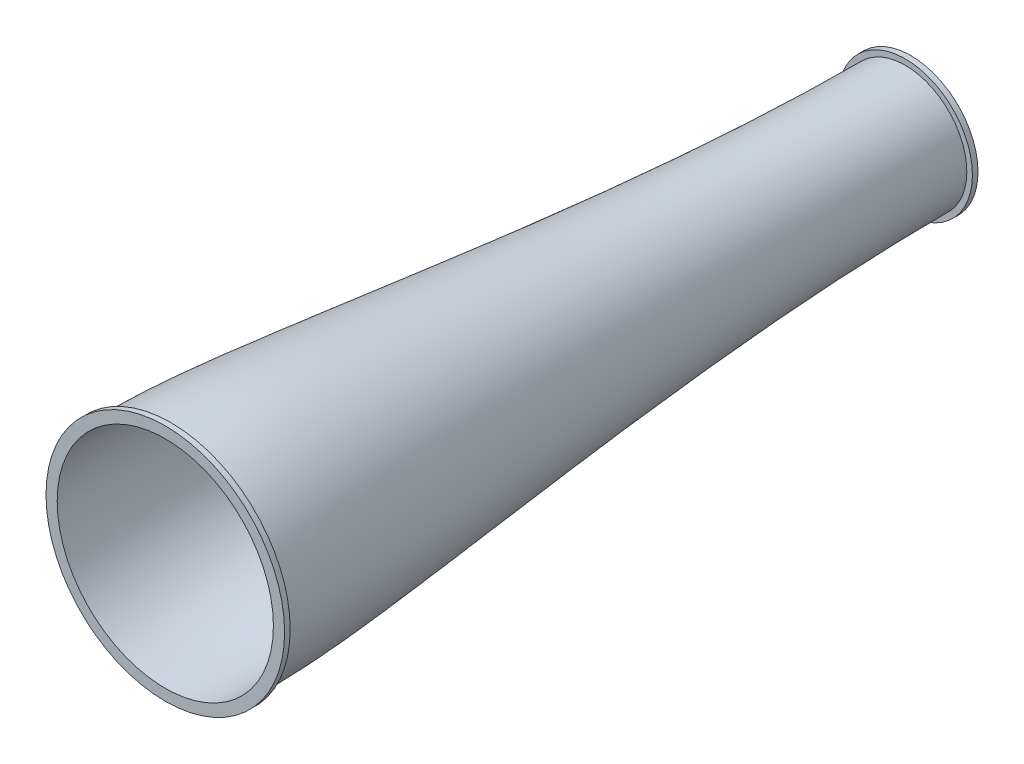
ISO-10303-21;
HEADER;
FILE_DESCRIPTION(('STEP AP214'),'2;1');
FILE_NAME('part.step','',(''),(''),'','','');
FILE_SCHEMA(('AUTOMOTIVE_DESIGN { 1 0 10303 214 1 1 1 1 }'));
ENDSEC;
DATA;
#1=APPLICATION_CONTEXT('core data for automotive mechanical design processes');
#2=APPLICATION_PROTOCOL_DEFINITION('international standard','automotive_design',2000,#1);
#3=PRODUCT_CONTEXT('',#1,'mechanical');
#4=PRODUCT('Part','Part','',(#3));
#5=PRODUCT_RELATED_PRODUCT_CATEGORY('part','',(#4));
#6=PRODUCT_DEFINITION_FORMATION('','',#4);
#7=PRODUCT_DEFINITION_CONTEXT('part definition',#1,'design');
#8=PRODUCT_DEFINITION('design','',#6,#7);
#9=PRODUCT_DEFINITION_SHAPE('','',#8);
#10=(LENGTH_UNIT() NAMED_UNIT(*) SI_UNIT(.MILLI.,.METRE.));
#11=(NAMED_UNIT(*) PLANE_ANGLE_UNIT() SI_UNIT($,.RADIAN.));
#12=(NAMED_UNIT(*) SI_UNIT($,.STERADIAN.) SOLID_ANGLE_UNIT());
#13=UNCERTAINTY_MEASURE_WITH_UNIT(LENGTH_MEASURE(1.E-05),#10,'distance_accuracy_value','');
#14=(GEOMETRIC_REPRESENTATION_CONTEXT(3) GLOBAL_UNCERTAINTY_ASSIGNED_CONTEXT((#13)) GLOBAL_UNIT_ASSIGNED_CONTEXT((#10,
#11,#12)) REPRESENTATION_CONTEXT('',''));
#15=CARTESIAN_POINT('',(0.,0.,0.));
#16=DIRECTION('',(0.,0.,1.));
#17=DIRECTION('',(1.,0.,0.));
#18=AXIS2_PLACEMENT_3D('',#15,#16,#17);
#19=CARTESIAN_POINT('',(0.,290.,0.));
#20=CARTESIAN_POINT('',(0.,290.,-210.));
#21=CARTESIAN_POINT('',(0.,285.592736725811,-320.));
#22=CARTESIAN_POINT('',(0.,231.831314371843,-740.));
#23=CARTESIAN_POINT('',(0.,170.439033920389,-1240.));
#24=CARTESIAN_POINT('',(0.,150.000000000001,-1630.));
#25=CARTESIAN_POINT('',(0.,150.,-2000.));
#26=B_SPLINE_CURVE_WITH_KNOTS('',6,(#19,#20,#21,#22,#23,#24,#25),.UNSPECIFIED.,.F.,.F.,(7,7),
(0.,1.),.UNSPECIFIED.);
#27=CARTESIAN_POINT('',(0.,0.,0.));
#28=DIRECTION('',(0.,0.,1.));
#29=AXIS1_PLACEMENT('',#27,#28);
#30=SURFACE_OF_REVOLUTION('',#26,#29);
#31=CARTESIAN_POINT('',(0.,0.,-2000.));
#32=DIRECTION('',(0.,0.,1.));
#33=DIRECTION('',(1.,0.,0.));
#34=AXIS2_PLACEMENT_3D('',#31,#32,#33);
#35=CIRCLE('',#34,150.);
#36=CARTESIAN_POINT('',(150.,0.,-2000.));
#37=VERTEX_POINT('',#36);
#38=EDGE_CURVE('E10',#37,#37,#35,.T.);
#39=ORIENTED_EDGE('',*,*,#38,.F.);
#40=EDGE_LOOP('',(#39));
#41=FACE_BOUND('',#40,.T.);
#42=CARTESIAN_POINT('',(0.,0.,0.));
#43=DIRECTION('',(0.,0.,1.));
#44=DIRECTION('',(1.,0.,0.));
#45=AXIS2_PLACEMENT_3D('',#42,#43,#44);
#46=CIRCLE('',#45,290.);
#47=CARTESIAN_POINT('',(290.,0.,0.));
#48=VERTEX_POINT('',#47);
#49=EDGE_CURVE('E79',#48,#48,#46,.T.);
#50=ORIENTED_EDGE('',*,*,#49,.T.);
#51=EDGE_LOOP('',(#50));
#52=FACE_BOUND('',#51,.T.);
#53=ADVANCED_FACE('F43',(#41,#52),#30,.T.);
#54=CARTESIAN_POINT('',(0.,150.,-2000.));
#55=DIRECTION('',(0.,0.,1.));
#56=DIRECTION('',(1.,0.,0.));
#57=AXIS2_PLACEMENT_3D('',#54,#55,#56);
#58=PLANE('',#57);
#59=CARTESIAN_POINT('',(0.,0.,-2000.));
#60=DIRECTION('',(0.,0.,1.));
#61=DIRECTION('',(1.,0.,0.));
#62=AXIS2_PLACEMENT_3D('',#59,#60,#61);
#63=CIRCLE('',#62,180.);
#64=CARTESIAN_POINT('',(180.,0.,-2000.));
#65=VERTEX_POINT('',#64);
#66=EDGE_CURVE('E51',#65,#65,#63,.T.);
#67=ORIENTED_EDGE('',*,*,#66,.F.);
#68=EDGE_LOOP('',(#67));
#69=FACE_BOUND('',#68,.T.);
#70=ORIENTED_EDGE('',*,*,#38,.T.);
#71=EDGE_LOOP('',(#70));
#72=FACE_BOUND('',#71,.T.);
#73=ADVANCED_FACE('F106',(#69,#72),#58,.F.);
#74=CARTESIAN_POINT('',(0.,0.,0.));
#75=DIRECTION('',(0.,0.,1.));
#76=DIRECTION('',(1.,0.,0.));
#77=AXIS2_PLACEMENT_3D('',#74,#75,#76);
#78=CYLINDRICAL_SURFACE('',#77,180.);
#79=CARTESIAN_POINT('',(0.,0.,-1985.));
#80=DIRECTION('',(0.,0.,1.));
#81=DIRECTION('',(1.,0.,0.));
#82=AXIS2_PLACEMENT_3D('',#79,#80,#81);
#83=CIRCLE('',#82,180.);
#84=CARTESIAN_POINT('',(180.,0.,-1985.));
#85=VERTEX_POINT('',#84);
#86=EDGE_CURVE('E56',#85,#85,#83,.T.);
#87=ORIENTED_EDGE('',*,*,#86,.F.);
#88=EDGE_LOOP('',(#87));
#89=FACE_BOUND('',#88,.T.);
#90=ORIENTED_EDGE('',*,*,#66,.T.);
#91=EDGE_LOOP('',(#90));
#92=FACE_BOUND('',#91,.T.);
#93=ADVANCED_FACE('F103',(#89,#92),#78,.T.);
#94=CARTESIAN_POINT('',(0.,165.014121035901,-1985.));
#95=DIRECTION('',(0.,0.,-1.));
#96=DIRECTION('',(-1.,0.,0.));
#97=AXIS2_PLACEMENT_3D('',#94,#95,#96);
#98=PLANE('',#97);
#99=CARTESIAN_POINT('',(0.,0.,-1985.));
#100=DIRECTION('',(0.,0.,1.));
#101=DIRECTION('',(1.,0.,0.));
#102=AXIS2_PLACEMENT_3D('',#99,#100,#101);
#103=CIRCLE('',#102,165.014121035901);
#104=CARTESIAN_POINT('',(165.014121035901,0.,-1985.));
#105=VERTEX_POINT('',#104);
#106=EDGE_CURVE('E61',#105,#105,#103,.T.);
#107=ORIENTED_EDGE('',*,*,#106,.F.);
#108=EDGE_LOOP('',(#107));
#109=FACE_BOUND('',#108,.T.);
#110=ORIENTED_EDGE('',*,*,#86,.T.);
#111=EDGE_LOOP('',(#110));
#112=FACE_BOUND('',#111,.T.);
#113=ADVANCED_FACE('F98',(#109,#112),#98,.F.);
#114=CARTESIAN_POINT('',(0.,165.014121035901,-1985.));
#115=CARTESIAN_POINT('',(0.,165.024850029944,-1979.32061825777));
#116=CARTESIAN_POINT('',(0.,165.05856834704,-1967.97213045618));
#117=CARTESIAN_POINT('',(0.,165.17657659615,-1945.19331127632));
#118=CARTESIAN_POINT('',(0.,165.421107940827,-1916.60966506937));
#119=CARTESIAN_POINT('',(0.,165.876134948668,-1882.08683909105));
#120=CARTESIAN_POINT('',(0.,166.704873447063,-1835.73442091189));
#121=CARTESIAN_POINT('',(0.,168.16727687444,-1777.13792060541));
#122=CARTESIAN_POINT('',(0.,170.621701870764,-1705.68064641818));
#123=CARTESIAN_POINT('',(0.,173.775318683966,-1633.06436377682));
#124=CARTESIAN_POINT('',(0.,178.890128219451,-1534.76884542532));
#125=CARTESIAN_POINT('',(0.,186.920430608635,-1409.39031181391));
#126=CARTESIAN_POINT('',(0.,198.78961943469,-1256.44761370207));
#127=CARTESIAN_POINT('',(0.,212.341700365872,-1103.24750222346));
#128=CARTESIAN_POINT('',(0.,226.92089478373,-952.452485630166));
#129=CARTESIAN_POINT('',(0.,241.811420266741,-806.921637044052));
#130=CARTESIAN_POINT('',(0.,256.28679261421,-669.44493870895));
#131=CARTESIAN_POINT('',(0.,269.658413144316,-542.464076383529));
#132=CARTESIAN_POINT('',(0.,281.32409042182,-427.777286694442));
#133=CARTESIAN_POINT('',(0.,290.817439904124,-326.22004969185));
#134=CARTESIAN_POINT('',(0.,296.679615174048,-252.172739592393));
#135=CARTESIAN_POINT('',(0.,300.116452444475,-198.230735563337));
#136=CARTESIAN_POINT('',(0.,302.089806853769,-159.963741938216));
#137=CARTESIAN_POINT('',(0.,303.495879269175,-123.328486508791));
#138=CARTESIAN_POINT('',(0.,304.244151218342,-93.5713812217425));
#139=CARTESIAN_POINT('',(0.,304.630157624343,-69.7968750545627));
#140=CARTESIAN_POINT('',(0.,304.793594795921,-54.8461171435212));
#141=CARTESIAN_POINT('',(0.,304.884719718417,-42.7627439112898));
#142=CARTESIAN_POINT('',(0.,304.935201378031,-33.621518188276));
#143=CARTESIAN_POINT('',(0.,304.964068351108,-25.9194958317963));
#144=CARTESIAN_POINT('',(0.,304.980294510533,-19.7045305045713));
#145=CARTESIAN_POINT('',(0.,304.986321957883,-16.5655531698138));
#146=CARTESIAN_POINT('',(0.,304.988841421193,-14.9999999999979));
#147=B_SPLINE_CURVE_WITH_KNOTS('',3,(#114,#115,#116,#117,#118,#119,#120,#121,#122,#123,#124,
#125,#126,#127,#128,#129,#130,#131,#132,#133,#134,#135,#136,#137,#138,#139,#140,#141,#142,#143,
#144,#145,#146),.UNSPECIFIED.,.F.,.F.,(4,1,1,1,1,1,1,1,1,1,1,1,1,1,1,1,1,1,1,1,1,1,1,1,1,1,1,1,
1,1,4),(0.0120471630240671,0.0197127078977861,0.0273782527715052,0.0427093425189432,
0.0580404322663812,0.0733715220138194,0.104033701508695,0.134695881003572,0.165358060498448,
0.196020239993324,0.257344598983076,0.318668957972828,0.379993316962581,0.441317675952333,
0.502642034942085,0.563966393931837,0.62529075292159,0.686615111911342,0.747939470901094,
0.809263829890846,0.839926009385723,0.870588188880599,0.901250368375475,0.931912547870351,
0.947243637617789,0.962574727365227,0.970240272238946,0.977905817112665,0.985571361986384,
0.989404134423244,0.993236906860103),.UNSPECIFIED.);
#148=CARTESIAN_POINT('',(0.,0.,0.));
#149=DIRECTION('',(0.,0.,1.));
#150=AXIS1_PLACEMENT('',#148,#149);
#151=SURFACE_OF_REVOLUTION('',#147,#150);
#152=CARTESIAN_POINT('',(0.,0.,-14.9999999999979));
#153=DIRECTION('',(0.,0.,1.));
#154=DIRECTION('',(1.,0.,0.));
#155=AXIS2_PLACEMENT_3D('',#152,#153,#154);
#156=CIRCLE('',#155,304.988841421193);
#157=CARTESIAN_POINT('',(304.988841421193,0.,-14.9999999999979));
#158=VERTEX_POINT('',#157);
#159=EDGE_CURVE('E67',#158,#158,#156,.T.);
#160=ORIENTED_EDGE('',*,*,#159,.F.);
#161=EDGE_LOOP('',(#160));
#162=FACE_BOUND('',#161,.T.);
#163=ORIENTED_EDGE('',*,*,#106,.T.);
#164=EDGE_LOOP('',(#163));
#165=FACE_BOUND('',#164,.T.);
#166=ADVANCED_FACE('F93',(#162,#165),#151,.T.);
#167=CARTESIAN_POINT('',(0.,320.,-14.9999999999989));
#168=DIRECTION('',(0.,0.,1.));
#169=DIRECTION('',(1.,0.,0.));
#170=AXIS2_PLACEMENT_3D('',#167,#168,#169);
#171=PLANE('',#170);
#172=CARTESIAN_POINT('',(0.,0.,-15.));
#173=DIRECTION('',(0.,0.,1.));
#174=DIRECTION('',(1.,0.,0.));
#175=AXIS2_PLACEMENT_3D('',#172,#173,#174);
#176=CIRCLE('',#175,320.);
#177=CARTESIAN_POINT('',(320.,0.,-15.));
#178=VERTEX_POINT('',#177);
#179=EDGE_CURVE('E71',#178,#178,#176,.T.);
#180=ORIENTED_EDGE('',*,*,#179,.F.);
#181=EDGE_LOOP('',(#180));
#182=FACE_BOUND('',#181,.T.);
#183=ORIENTED_EDGE('',*,*,#159,.T.);
#184=EDGE_LOOP('',(#183));
#185=FACE_BOUND('',#184,.T.);
#186=ADVANCED_FACE('F97',(#182,#185),#171,.F.);
#187=CARTESIAN_POINT('',(0.,0.,0.));
#188=DIRECTION('',(0.,0.,1.));
#189=DIRECTION('',(1.,0.,0.));
#190=AXIS2_PLACEMENT_3D('',#187,#188,#189);
#191=CYLINDRICAL_SURFACE('',#190,320.);
#192=CARTESIAN_POINT('',(0.,0.,0.));
#193=DIRECTION('',(0.,0.,1.));
#194=DIRECTION('',(1.,0.,0.));
#195=AXIS2_PLACEMENT_3D('',#192,#193,#194);
#196=CIRCLE('',#195,320.);
#197=CARTESIAN_POINT('',(320.,0.,0.));
#198=VERTEX_POINT('',#197);
#199=EDGE_CURVE('E75',#198,#198,#196,.T.);
#200=ORIENTED_EDGE('',*,*,#199,.F.);
#201=EDGE_LOOP('',(#200));
#202=FACE_BOUND('',#201,.T.);
#203=ORIENTED_EDGE('',*,*,#179,.T.);
#204=EDGE_LOOP('',(#203));
#205=FACE_BOUND('',#204,.T.);
#206=ADVANCED_FACE('F122',(#202,#205),#191,.T.);
#207=CARTESIAN_POINT('',(0.,320.,0.));
#208=DIRECTION('',(0.,0.,-1.));
#209=DIRECTION('',(-1.,0.,0.));
#210=AXIS2_PLACEMENT_3D('',#207,#208,#209);
#211=PLANE('',#210);
#212=ORIENTED_EDGE('',*,*,#49,.F.);
#213=EDGE_LOOP('',(#212));
#214=FACE_BOUND('',#213,.T.);
#215=ORIENTED_EDGE('',*,*,#199,.T.);
#216=EDGE_LOOP('',(#215));
#217=FACE_BOUND('',#216,.T.);
#218=ADVANCED_FACE('F119',(#214,#217),#211,.F.);
#219=CLOSED_SHELL('',(#53,#73,#93,#113,#166,#186,#206,#218));
#220=MANIFOLD_SOLID_BREP('B2',#219);
#221=ADVANCED_BREP_SHAPE_REPRESENTATION('',(#18,#220),#14);
#222=SHAPE_DEFINITION_REPRESENTATION(#9,#221);
ENDSEC;
END-ISO-10303-21;
